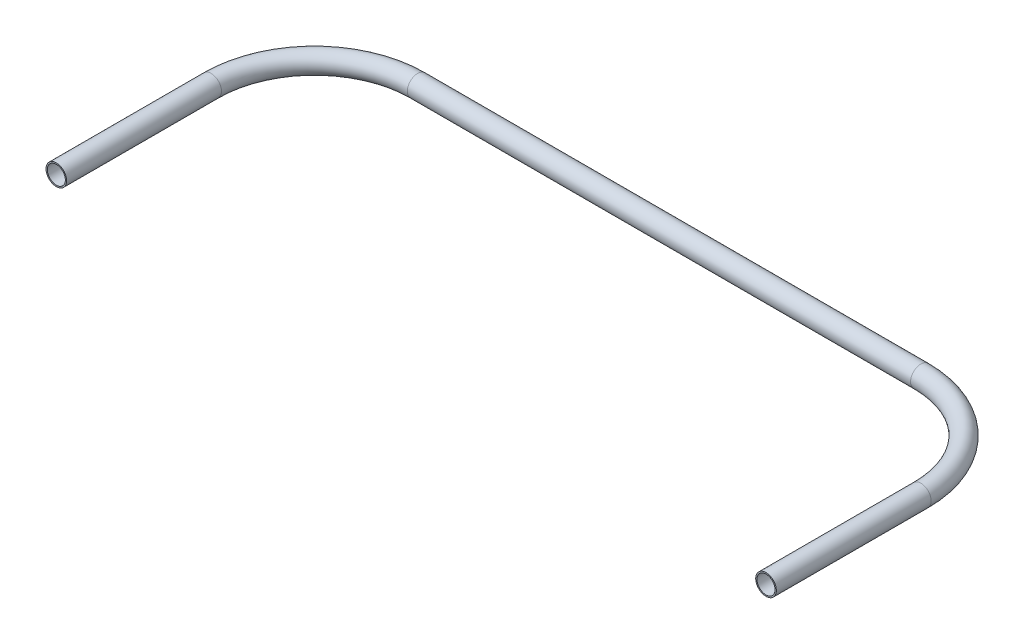
ISO-10303-21;
HEADER;
FILE_DESCRIPTION(('STEP AP214'),'2;1');
FILE_NAME('part.step','',(''),(''),'','','');
FILE_SCHEMA(('AUTOMOTIVE_DESIGN { 1 0 10303 214 1 1 1 1 }'));
ENDSEC;
DATA;
#1=APPLICATION_CONTEXT('core data for automotive mechanical design processes');
#2=APPLICATION_PROTOCOL_DEFINITION('international standard','automotive_design',2000,#1);
#3=PRODUCT_CONTEXT('',#1,'mechanical');
#4=PRODUCT('Part','Part','',(#3));
#5=PRODUCT_RELATED_PRODUCT_CATEGORY('part','',(#4));
#6=PRODUCT_DEFINITION_FORMATION('','',#4);
#7=PRODUCT_DEFINITION_CONTEXT('part definition',#1,'design');
#8=PRODUCT_DEFINITION('design','',#6,#7);
#9=PRODUCT_DEFINITION_SHAPE('','',#8);
#10=(LENGTH_UNIT() NAMED_UNIT(*) SI_UNIT(.MILLI.,.METRE.));
#11=(NAMED_UNIT(*) PLANE_ANGLE_UNIT() SI_UNIT($,.RADIAN.));
#12=(NAMED_UNIT(*) SI_UNIT($,.STERADIAN.) SOLID_ANGLE_UNIT());
#13=UNCERTAINTY_MEASURE_WITH_UNIT(LENGTH_MEASURE(1.E-05),#10,'distance_accuracy_value','');
#14=(GEOMETRIC_REPRESENTATION_CONTEXT(3) GLOBAL_UNCERTAINTY_ASSIGNED_CONTEXT((#13)) GLOBAL_UNIT_ASSIGNED_CONTEXT((#10,
#11,#12)) REPRESENTATION_CONTEXT('',''));
#15=CARTESIAN_POINT('',(0.,0.,0.));
#16=DIRECTION('',(0.,0.,1.));
#17=DIRECTION('',(1.,0.,0.));
#18=AXIS2_PLACEMENT_3D('',#15,#16,#17);
#19=CARTESIAN_POINT('',(0.,0.,0.));
#20=DIRECTION('',(-1.,0.,0.));
#21=DIRECTION('',(0.,0.,1.));
#22=AXIS2_PLACEMENT_3D('',#19,#20,#21);
#23=CYLINDRICAL_SURFACE('',#22,8.);
#24=CARTESIAN_POINT('',(-195.,0.,0.));
#25=DIRECTION('',(1.,0.,0.));
#26=DIRECTION('',(0.,0.,-1.));
#27=AXIS2_PLACEMENT_3D('',#24,#25,#26);
#28=CIRCLE('',#27,8.);
#29=CARTESIAN_POINT('',(-195.,0.,-7.99999999999999));
#30=VERTEX_POINT('',#29);
#31=EDGE_CURVE('E54',#30,#30,#28,.T.);
#32=ORIENTED_EDGE('',*,*,#31,.T.);
#33=EDGE_LOOP('',(#32));
#34=FACE_BOUND('',#33,.T.);
#35=CARTESIAN_POINT('',(195.,0.,0.));
#36=DIRECTION('',(1.,0.,0.));
#37=DIRECTION('',(0.,0.,-1.));
#38=AXIS2_PLACEMENT_3D('',#35,#36,#37);
#39=CIRCLE('',#38,8.);
#40=CARTESIAN_POINT('',(195.,0.,-7.99999999999999));
#41=VERTEX_POINT('',#40);
#42=EDGE_CURVE('E74',#41,#41,#39,.T.);
#43=ORIENTED_EDGE('',*,*,#42,.F.);
#44=EDGE_LOOP('',(#43));
#45=FACE_BOUND('',#44,.T.);
#46=ADVANCED_FACE('F35',(#34,#45),#23,.T.);
#47=CARTESIAN_POINT('',(-195.,0.,80.));
#48=DIRECTION('',(0.,1.,0.));
#49=DIRECTION('',(0.,0.,1.));
#50=AXIS2_PLACEMENT_3D('',#47,#48,#49);
#51=TOROIDAL_SURFACE('',#50,80.,8.);
#52=CARTESIAN_POINT('',(-275.,0.,80.));
#53=DIRECTION('',(0.,0.,-1.));
#54=DIRECTION('',(-1.,0.,0.));
#55=AXIS2_PLACEMENT_3D('',#52,#53,#54);
#56=CIRCLE('',#55,8.);
#57=CARTESIAN_POINT('',(-283.,0.,80.));
#58=VERTEX_POINT('',#57);
#59=EDGE_CURVE('E39',#58,#58,#56,.T.);
#60=CARTESIAN_POINT('',(-195.,0.,80.));
#61=DIRECTION('',(0.,1.,0.));
#62=DIRECTION('',(0.,0.,1.));
#63=AXIS2_PLACEMENT_3D('',#60,#61,#62);
#64=CIRCLE('',#63,88.);
#65=EDGE_CURVE('',#30,#58,#64,.T.);
#66=ORIENTED_EDGE('',*,*,#31,.F.);
#67=ORIENTED_EDGE('',*,*,#59,.T.);
#68=ORIENTED_EDGE('',*,*,#65,.T.);
#69=ORIENTED_EDGE('',*,*,#65,.F.);
#70=EDGE_LOOP('',(#66,#68,#67,#69));
#71=FACE_BOUND('',#70,.T.);
#72=ADVANCED_FACE('F103',(#71),#51,.T.);
#73=CARTESIAN_POINT('',(-275.,0.,80.0000000000001));
#74=DIRECTION('',(0.,0.,1.));
#75=DIRECTION('',(1.,0.,0.));
#76=AXIS2_PLACEMENT_3D('',#73,#74,#75);
#77=CYLINDRICAL_SURFACE('',#76,8.);
#78=CARTESIAN_POINT('',(-275.,0.,200.));
#79=DIRECTION('',(0.,0.,-1.));
#80=DIRECTION('',(-1.,0.,0.));
#81=AXIS2_PLACEMENT_3D('',#78,#79,#80);
#82=CIRCLE('',#81,8.);
#83=CARTESIAN_POINT('',(-283.,0.,200.));
#84=VERTEX_POINT('',#83);
#85=EDGE_CURVE('E52',#84,#84,#82,.T.);
#86=ORIENTED_EDGE('',*,*,#85,.T.);
#87=EDGE_LOOP('',(#86));
#88=FACE_BOUND('',#87,.T.);
#89=ORIENTED_EDGE('',*,*,#59,.F.);
#90=EDGE_LOOP('',(#89));
#91=FACE_BOUND('',#90,.T.);
#92=ADVANCED_FACE('F37',(#88,#91),#77,.T.);
#93=CARTESIAN_POINT('',(-275.,0.,200.));
#94=DIRECTION('',(0.,0.,-1.));
#95=DIRECTION('',(-1.,0.,0.));
#96=AXIS2_PLACEMENT_3D('',#93,#94,#95);
#97=PLANE('',#96);
#98=CARTESIAN_POINT('',(-275.,0.,200.));
#99=DIRECTION('',(0.,0.,-1.));
#100=DIRECTION('',(-1.,0.,0.));
#101=AXIS2_PLACEMENT_3D('',#98,#99,#100);
#102=CIRCLE('',#101,7.);
#103=CARTESIAN_POINT('',(-282.,0.,200.));
#104=VERTEX_POINT('',#103);
#105=EDGE_CURVE('E10',#104,#104,#102,.F.);
#106=ORIENTED_EDGE('',*,*,#105,.F.);
#107=EDGE_LOOP('',(#106));
#108=FACE_BOUND('',#107,.T.);
#109=ORIENTED_EDGE('',*,*,#85,.F.);
#110=EDGE_LOOP('',(#109));
#111=FACE_BOUND('',#110,.T.);
#112=ADVANCED_FACE('F95',(#108,#111),#97,.F.);
#113=CARTESIAN_POINT('',(0.,0.,0.));
#114=DIRECTION('',(-1.,0.,0.));
#115=DIRECTION('',(0.,0.,1.));
#116=AXIS2_PLACEMENT_3D('',#113,#114,#115);
#117=CYLINDRICAL_SURFACE('',#116,7.);
#118=CARTESIAN_POINT('',(-195.,0.,0.));
#119=DIRECTION('',(1.,0.,0.));
#120=DIRECTION('',(0.,0.,-1.));
#121=AXIS2_PLACEMENT_3D('',#118,#119,#120);
#122=CIRCLE('',#121,7.);
#123=CARTESIAN_POINT('',(-195.,0.,-6.99999999999999));
#124=VERTEX_POINT('',#123);
#125=EDGE_CURVE('E48',#124,#124,#122,.F.);
#126=ORIENTED_EDGE('',*,*,#125,.T.);
#127=EDGE_LOOP('',(#126));
#128=FACE_BOUND('',#127,.T.);
#129=CARTESIAN_POINT('',(195.,0.,0.));
#130=DIRECTION('',(1.,0.,0.));
#131=DIRECTION('',(0.,0.,-1.));
#132=AXIS2_PLACEMENT_3D('',#129,#130,#131);
#133=CIRCLE('',#132,7.);
#134=CARTESIAN_POINT('',(195.,0.,-6.99999999999999));
#135=VERTEX_POINT('',#134);
#136=EDGE_CURVE('E66',#135,#135,#133,.F.);
#137=ORIENTED_EDGE('',*,*,#136,.F.);
#138=EDGE_LOOP('',(#137));
#139=FACE_BOUND('',#138,.T.);
#140=ADVANCED_FACE('F81',(#128,#139),#117,.F.);
#141=CARTESIAN_POINT('',(-195.,0.,80.));
#142=DIRECTION('',(0.,1.,0.));
#143=DIRECTION('',(0.,0.,1.));
#144=AXIS2_PLACEMENT_3D('',#141,#142,#143);
#145=TOROIDAL_SURFACE('',#144,80.,7.);
#146=CARTESIAN_POINT('',(-275.,0.,80.));
#147=DIRECTION('',(0.,0.,-1.));
#148=DIRECTION('',(-1.,0.,0.));
#149=AXIS2_PLACEMENT_3D('',#146,#147,#148);
#150=CIRCLE('',#149,7.);
#151=CARTESIAN_POINT('',(-282.,0.,80.));
#152=VERTEX_POINT('',#151);
#153=EDGE_CURVE('E43',#152,#152,#150,.F.);
#154=CARTESIAN_POINT('',(-195.,0.,80.));
#155=DIRECTION('',(0.,1.,0.));
#156=DIRECTION('',(0.,0.,1.));
#157=AXIS2_PLACEMENT_3D('',#154,#155,#156);
#158=CIRCLE('',#157,87.);
#159=EDGE_CURVE('',#124,#152,#158,.T.);
#160=ORIENTED_EDGE('',*,*,#125,.F.);
#161=ORIENTED_EDGE('',*,*,#153,.T.);
#162=ORIENTED_EDGE('',*,*,#159,.T.);
#163=ORIENTED_EDGE('',*,*,#159,.F.);
#164=EDGE_LOOP('',(#160,#162,#161,#163));
#165=FACE_BOUND('',#164,.T.);
#166=ADVANCED_FACE('F84',(#165),#145,.F.);
#167=CARTESIAN_POINT('',(-275.,0.,80.0000000000001));
#168=DIRECTION('',(0.,0.,1.));
#169=DIRECTION('',(1.,0.,0.));
#170=AXIS2_PLACEMENT_3D('',#167,#168,#169);
#171=CYLINDRICAL_SURFACE('',#170,7.);
#172=ORIENTED_EDGE('',*,*,#105,.T.);
#173=EDGE_LOOP('',(#172));
#174=FACE_BOUND('',#173,.T.);
#175=ORIENTED_EDGE('',*,*,#153,.F.);
#176=EDGE_LOOP('',(#175));
#177=FACE_BOUND('',#176,.T.);
#178=ADVANCED_FACE('F86',(#174,#177),#171,.F.);
#179=CARTESIAN_POINT('',(195.,0.,80.));
#180=DIRECTION('',(0.,1.,0.));
#181=DIRECTION('',(0.,0.,1.));
#182=AXIS2_PLACEMENT_3D('',#179,#180,#181);
#183=TOROIDAL_SURFACE('',#182,80.,8.);
#184=CARTESIAN_POINT('',(275.,0.,80.));
#185=DIRECTION('',(0.,0.,1.));
#186=DIRECTION('',(1.,0.,0.));
#187=AXIS2_PLACEMENT_3D('',#184,#185,#186);
#188=CIRCLE('',#187,8.);
#189=CARTESIAN_POINT('',(283.,0.,80.));
#190=VERTEX_POINT('',#189);
#191=EDGE_CURVE('E73',#190,#190,#188,.T.);
#192=CARTESIAN_POINT('',(195.,0.,80.));
#193=DIRECTION('',(0.,1.,0.));
#194=DIRECTION('',(0.,0.,1.));
#195=AXIS2_PLACEMENT_3D('',#192,#193,#194);
#196=CIRCLE('',#195,88.);
#197=EDGE_CURVE('',#190,#41,#196,.T.);
#198=ORIENTED_EDGE('',*,*,#191,.F.);
#199=ORIENTED_EDGE('',*,*,#42,.T.);
#200=ORIENTED_EDGE('',*,*,#197,.T.);
#201=ORIENTED_EDGE('',*,*,#197,.F.);
#202=EDGE_LOOP('',(#198,#200,#199,#201));
#203=FACE_BOUND('',#202,.T.);
#204=ADVANCED_FACE('F93',(#203),#183,.T.);
#205=CARTESIAN_POINT('',(275.,0.,80.0000000000001));
#206=DIRECTION('',(0.,0.,1.));
#207=DIRECTION('',(-1.,0.,0.));
#208=AXIS2_PLACEMENT_3D('',#205,#206,#207);
#209=CYLINDRICAL_SURFACE('',#208,8.);
#210=CARTESIAN_POINT('',(275.,0.,200.));
#211=DIRECTION('',(0.,0.,1.));
#212=DIRECTION('',(1.,0.,0.));
#213=AXIS2_PLACEMENT_3D('',#210,#211,#212);
#214=CIRCLE('',#213,8.);
#215=CARTESIAN_POINT('',(283.,0.,200.));
#216=VERTEX_POINT('',#215);
#217=EDGE_CURVE('E70',#216,#216,#214,.T.);
#218=ORIENTED_EDGE('',*,*,#217,.F.);
#219=EDGE_LOOP('',(#218));
#220=FACE_BOUND('',#219,.T.);
#221=ORIENTED_EDGE('',*,*,#191,.T.);
#222=EDGE_LOOP('',(#221));
#223=FACE_BOUND('',#222,.T.);
#224=ADVANCED_FACE('F141',(#220,#223),#209,.T.);
#225=CARTESIAN_POINT('',(275.,0.,200.));
#226=DIRECTION('',(0.,0.,-1.));
#227=DIRECTION('',(1.,0.,0.));
#228=AXIS2_PLACEMENT_3D('',#225,#226,#227);
#229=PLANE('',#228);
#230=CARTESIAN_POINT('',(275.,0.,200.));
#231=DIRECTION('',(0.,0.,1.));
#232=DIRECTION('',(1.,0.,0.));
#233=AXIS2_PLACEMENT_3D('',#230,#231,#232);
#234=CIRCLE('',#233,7.);
#235=CARTESIAN_POINT('',(282.,0.,200.));
#236=VERTEX_POINT('',#235);
#237=EDGE_CURVE('E56',#236,#236,#234,.F.);
#238=ORIENTED_EDGE('',*,*,#237,.T.);
#239=EDGE_LOOP('',(#238));
#240=FACE_BOUND('',#239,.T.);
#241=ORIENTED_EDGE('',*,*,#217,.T.);
#242=EDGE_LOOP('',(#241));
#243=FACE_BOUND('',#242,.T.);
#244=ADVANCED_FACE('F151',(#240,#243),#229,.F.);
#245=CARTESIAN_POINT('',(195.,0.,80.));
#246=DIRECTION('',(0.,1.,0.));
#247=DIRECTION('',(0.,0.,1.));
#248=AXIS2_PLACEMENT_3D('',#245,#246,#247);
#249=TOROIDAL_SURFACE('',#248,80.,7.);
#250=CARTESIAN_POINT('',(275.,0.,80.));
#251=DIRECTION('',(0.,0.,1.));
#252=DIRECTION('',(1.,0.,0.));
#253=AXIS2_PLACEMENT_3D('',#250,#251,#252);
#254=CIRCLE('',#253,7.);
#255=CARTESIAN_POINT('',(282.,0.,80.));
#256=VERTEX_POINT('',#255);
#257=EDGE_CURVE('E61',#256,#256,#254,.F.);
#258=CARTESIAN_POINT('',(195.,0.,80.));
#259=DIRECTION('',(0.,1.,0.));
#260=DIRECTION('',(0.,0.,1.));
#261=AXIS2_PLACEMENT_3D('',#258,#259,#260);
#262=CIRCLE('',#261,87.);
#263=EDGE_CURVE('',#256,#135,#262,.T.);
#264=ORIENTED_EDGE('',*,*,#257,.F.);
#265=ORIENTED_EDGE('',*,*,#136,.T.);
#266=ORIENTED_EDGE('',*,*,#263,.T.);
#267=ORIENTED_EDGE('',*,*,#263,.F.);
#268=EDGE_LOOP('',(#264,#266,#265,#267));
#269=FACE_BOUND('',#268,.T.);
#270=ADVANCED_FACE('F160',(#269),#249,.F.);
#271=CARTESIAN_POINT('',(275.,0.,80.0000000000001));
#272=DIRECTION('',(0.,0.,1.));
#273=DIRECTION('',(-1.,0.,0.));
#274=AXIS2_PLACEMENT_3D('',#271,#272,#273);
#275=CYLINDRICAL_SURFACE('',#274,7.);
#276=ORIENTED_EDGE('',*,*,#237,.F.);
#277=EDGE_LOOP('',(#276));
#278=FACE_BOUND('',#277,.T.);
#279=ORIENTED_EDGE('',*,*,#257,.T.);
#280=EDGE_LOOP('',(#279));
#281=FACE_BOUND('',#280,.T.);
#282=ADVANCED_FACE('F169',(#278,#281),#275,.F.);
#283=CLOSED_SHELL('',(#46,#72,#92,#112,#140,#166,#178,#204,#224,#244,#270,#282));
#284=MANIFOLD_SOLID_BREP('B2',#283);
#285=ADVANCED_BREP_SHAPE_REPRESENTATION('',(#18,#284),#14);
#286=SHAPE_DEFINITION_REPRESENTATION(#9,#285);
ENDSEC;
END-ISO-10303-21;
